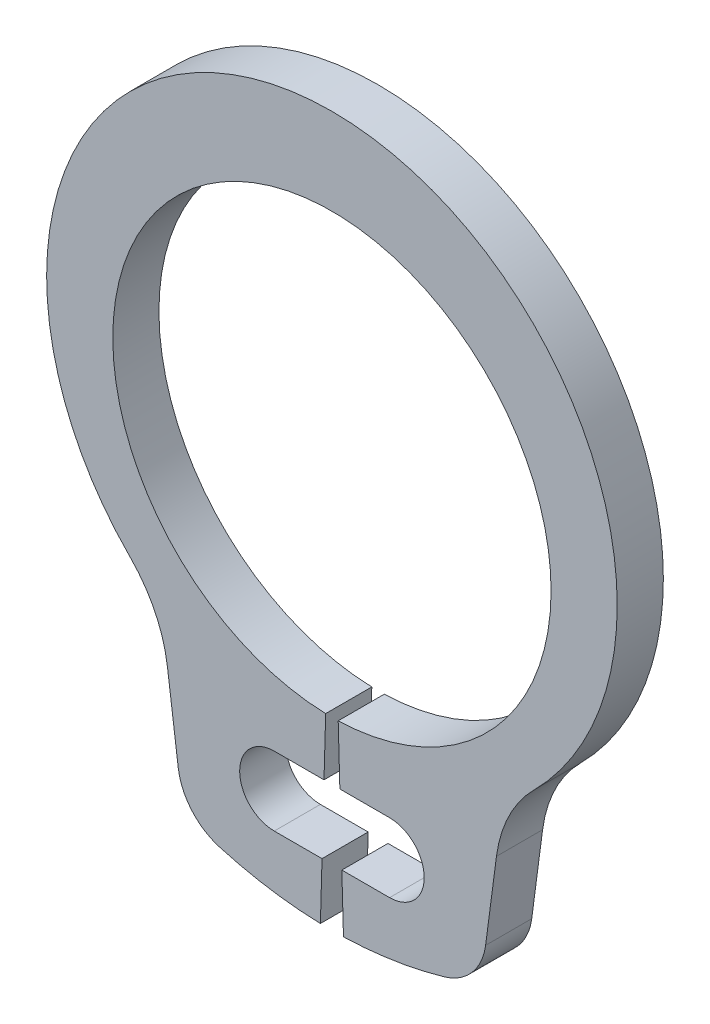
ISO-10303-21;
HEADER;
FILE_DESCRIPTION(('STEP AP214'),'2;1');
FILE_NAME('part.step','',(''),(''),'','','');
FILE_SCHEMA(('AUTOMOTIVE_DESIGN { 1 0 10303 214 1 1 1 1 }'));
ENDSEC;
DATA;
#1=APPLICATION_CONTEXT('core data for automotive mechanical design processes');
#2=APPLICATION_PROTOCOL_DEFINITION('international standard','automotive_design',2000,#1);
#3=PRODUCT_CONTEXT('',#1,'mechanical');
#4=PRODUCT('Part','Part','',(#3));
#5=PRODUCT_RELATED_PRODUCT_CATEGORY('part','',(#4));
#6=PRODUCT_DEFINITION_FORMATION('','',#4);
#7=PRODUCT_DEFINITION_CONTEXT('part definition',#1,'design');
#8=PRODUCT_DEFINITION('design','',#6,#7);
#9=PRODUCT_DEFINITION_SHAPE('','',#8);
#10=(LENGTH_UNIT() NAMED_UNIT(*) SI_UNIT(.MILLI.,.METRE.));
#11=(NAMED_UNIT(*) PLANE_ANGLE_UNIT() SI_UNIT($,.RADIAN.));
#12=(NAMED_UNIT(*) SI_UNIT($,.STERADIAN.) SOLID_ANGLE_UNIT());
#13=UNCERTAINTY_MEASURE_WITH_UNIT(LENGTH_MEASURE(1.E-05),#10,'distance_accuracy_value','');
#14=(GEOMETRIC_REPRESENTATION_CONTEXT(3) GLOBAL_UNCERTAINTY_ASSIGNED_CONTEXT((#13)) GLOBAL_UNIT_ASSIGNED_CONTEXT((#10,
#11,#12)) REPRESENTATION_CONTEXT('',''));
#15=CARTESIAN_POINT('',(0.,0.,0.));
#16=DIRECTION('',(0.,0.,1.));
#17=DIRECTION('',(1.,0.,0.));
#18=AXIS2_PLACEMENT_3D('',#15,#16,#17);
#19=CARTESIAN_POINT('',(-0.108571428571429,-3.7984486629278,-0.8));
#20=DIRECTION('',(0.999591753402051,-0.0285714285714286,0.));
#21=DIRECTION('',(0.0285714285714286,0.999591753402052,0.));
#22=AXIS2_PLACEMENT_3D('',#19,#20,#21);
#23=PLANE('',#22);
#24=DIRECTION('',(0.,0.,1.));
#25=VECTOR('',#24,1.);
#26=CARTESIAN_POINT('',(-0.13743687708596,-4.80832691319598,-0.8));
#27=LINE('',#26,#25);
#28=CARTESIAN_POINT('',(-0.13743687708596,-4.80832691319598,-0.8));
#29=VERTEX_POINT('',#28);
#30=CARTESIAN_POINT('',(-0.13743687708596,-4.80832691319598,0.));
#31=VERTEX_POINT('',#30);
#32=EDGE_CURVE('E203',#29,#31,#27,.T.);
#33=ORIENTED_EDGE('',*,*,#32,.F.);
#34=DIRECTION('',(0.0285714285714286,0.999591753402051,0.));
#35=VECTOR('',#34,1.);
#36=CARTESIAN_POINT('',(-0.108571428571429,-3.7984486629278,-0.8));
#37=LINE('',#36,#35);
#38=CARTESIAN_POINT('',(-0.108571428571429,-3.7984486629278,-0.8));
#39=VERTEX_POINT('',#38);
#40=EDGE_CURVE('E192',#29,#39,#37,.T.);
#41=ORIENTED_EDGE('',*,*,#40,.T.);
#42=DIRECTION('',(0.,0.,1.));
#43=VECTOR('',#42,1.);
#44=CARTESIAN_POINT('',(-0.108571428571429,-3.7984486629278,-0.8));
#45=LINE('',#44,#43);
#46=CARTESIAN_POINT('',(-0.108571428571429,-3.7984486629278,0.));
#47=VERTEX_POINT('',#46);
#48=EDGE_CURVE('E11',#39,#47,#45,.T.);
#49=ORIENTED_EDGE('',*,*,#48,.T.);
#50=DIRECTION('',(0.0285714285714286,0.999591753402051,0.));
#51=VECTOR('',#50,1.);
#52=CARTESIAN_POINT('',(-0.108571428571429,-3.7984486629278,0.));
#53=LINE('',#52,#51);
#54=EDGE_CURVE('E281',#31,#47,#53,.T.);
#55=ORIENTED_EDGE('',*,*,#54,.F.);
#56=EDGE_LOOP('',(#33,#41,#49,#55));
#57=FACE_BOUND('',#56,.T.);
#58=ADVANCED_FACE('F32',(#57),#23,.T.);
#59=CARTESIAN_POINT('',(0.108571428571429,-3.7984486629278,-0.8));
#60=DIRECTION('',(-0.999591753402051,-0.0285714285714286,0.));
#61=DIRECTION('',(0.0285714285714286,-0.999591753402052,0.));
#62=AXIS2_PLACEMENT_3D('',#59,#60,#61);
#63=PLANE('',#62);
#64=DIRECTION('',(0.,0.,-1.));
#65=VECTOR('',#64,1.);
#66=CARTESIAN_POINT('',(0.13743687708596,-4.80832691319598,-0.8));
#67=LINE('',#66,#65);
#68=CARTESIAN_POINT('',(0.13743687708596,-4.80832691319598,0.));
#69=VERTEX_POINT('',#68);
#70=CARTESIAN_POINT('',(0.13743687708596,-4.80832691319598,-0.8));
#71=VERTEX_POINT('',#70);
#72=EDGE_CURVE('E314',#69,#71,#67,.T.);
#73=ORIENTED_EDGE('',*,*,#72,.F.);
#74=DIRECTION('',(0.0285714285714286,-0.999591753402051,0.));
#75=VECTOR('',#74,1.);
#76=CARTESIAN_POINT('',(0.108571428571429,-3.7984486629278,0.));
#77=LINE('',#76,#75);
#78=CARTESIAN_POINT('',(0.108571428571429,-3.7984486629278,0.));
#79=VERTEX_POINT('',#78);
#80=EDGE_CURVE('E251',#79,#69,#77,.T.);
#81=ORIENTED_EDGE('',*,*,#80,.F.);
#82=DIRECTION('',(0.,0.,1.));
#83=VECTOR('',#82,1.);
#84=CARTESIAN_POINT('',(0.108571428571429,-3.7984486629278,-0.8));
#85=LINE('',#84,#83);
#86=CARTESIAN_POINT('',(0.108571428571429,-3.7984486629278,-0.8));
#87=VERTEX_POINT('',#86);
#88=EDGE_CURVE('E36',#87,#79,#85,.T.);
#89=ORIENTED_EDGE('',*,*,#88,.F.);
#90=DIRECTION('',(0.0285714285714286,-0.999591753402051,0.));
#91=VECTOR('',#90,1.);
#92=CARTESIAN_POINT('',(0.108571428571429,-3.7984486629278,-0.8));
#93=LINE('',#92,#91);
#94=EDGE_CURVE('E215',#87,#71,#93,.T.);
#95=ORIENTED_EDGE('',*,*,#94,.T.);
#96=EDGE_LOOP('',(#73,#81,#89,#95));
#97=FACE_BOUND('',#96,.T.);
#98=ADVANCED_FACE('F313',(#97),#63,.T.);
#99=CARTESIAN_POINT('',(0.,0.,-0.8));
#100=DIRECTION('',(0.,0.,1.));
#101=DIRECTION('',(1.,0.,0.));
#102=AXIS2_PLACEMENT_3D('',#99,#100,#101);
#103=CYLINDRICAL_SURFACE('',#102,3.8);
#104=CARTESIAN_POINT('',(0.,0.,0.));
#105=DIRECTION('',(0.,0.,-1.));
#106=DIRECTION('',(1.,0.,0.));
#107=AXIS2_PLACEMENT_3D('',#104,#105,#106);
#108=CIRCLE('',#107,3.8);
#109=EDGE_CURVE('E208',#47,#79,#108,.T.);
#110=ORIENTED_EDGE('',*,*,#109,.F.);
#111=ORIENTED_EDGE('',*,*,#48,.F.);
#112=CARTESIAN_POINT('',(0.,0.,-0.8));
#113=DIRECTION('',(0.,0.,-1.));
#114=DIRECTION('',(1.,0.,0.));
#115=AXIS2_PLACEMENT_3D('',#112,#113,#114);
#116=CIRCLE('',#115,3.8);
#117=EDGE_CURVE('E210',#39,#87,#116,.T.);
#118=ORIENTED_EDGE('',*,*,#117,.T.);
#119=ORIENTED_EDGE('',*,*,#88,.T.);
#120=EDGE_LOOP('',(#110,#111,#118,#119));
#121=FACE_BOUND('',#120,.T.);
#122=ADVANCED_FACE('F34',(#121),#103,.F.);
#123=DIRECTION('',(0.,0.,-1.));
#124=VECTOR('',#123,1.);
#125=CARTESIAN_POINT('',(-0.171736594114461,-6.00832691319598,-0.8));
#126=LINE('',#125,#124);
#127=CARTESIAN_POINT('',(-0.171736594114461,-6.00832691319598,0.));
#128=VERTEX_POINT('',#127);
#129=CARTESIAN_POINT('',(-0.171736594114461,-6.00832691319598,-0.8));
#130=VERTEX_POINT('',#129);
#131=EDGE_CURVE('E335',#128,#130,#126,.T.);
#132=ORIENTED_EDGE('',*,*,#131,.F.);
#133=CARTESIAN_POINT('',(-0.2,-6.99714227381436,0.));
#134=VERTEX_POINT('',#133);
#135=EDGE_CURVE('E214',#134,#128,#53,.T.);
#136=ORIENTED_EDGE('',*,*,#135,.F.);
#137=DIRECTION('',(0.,0.,1.));
#138=VECTOR('',#137,1.);
#139=CARTESIAN_POINT('',(-0.2,-6.99714227381436,-0.8));
#140=LINE('',#139,#138);
#141=CARTESIAN_POINT('',(-0.2,-6.99714227381436,-0.8));
#142=VERTEX_POINT('',#141);
#143=EDGE_CURVE('E41',#142,#134,#140,.T.);
#144=ORIENTED_EDGE('',*,*,#143,.F.);
#145=EDGE_CURVE('E245',#142,#130,#37,.T.);
#146=ORIENTED_EDGE('',*,*,#145,.T.);
#147=EDGE_LOOP('',(#132,#136,#144,#146));
#148=FACE_BOUND('',#147,.T.);
#149=ADVANCED_FACE('F383',(#148),#23,.T.);
#150=CARTESIAN_POINT('',(0.,0.,-0.8));
#151=DIRECTION('',(0.,0.,1.));
#152=DIRECTION('',(1.,0.,0.));
#153=AXIS2_PLACEMENT_3D('',#150,#151,#152);
#154=CYLINDRICAL_SURFACE('',#153,7.);
#155=CARTESIAN_POINT('',(0.,0.,0.));
#156=DIRECTION('',(0.,0.,1.));
#157=DIRECTION('',(1.,0.,0.));
#158=AXIS2_PLACEMENT_3D('',#155,#156,#157);
#159=CIRCLE('',#158,7.);
#160=CARTESIAN_POINT('',(-1.95199270347282,-6.72233028685655,0.));
#161=VERTEX_POINT('',#160);
#162=EDGE_CURVE('E278',#161,#134,#159,.T.);
#163=ORIENTED_EDGE('',*,*,#162,.F.);
#164=DIRECTION('',(0.,0.,1.));
#165=VECTOR('',#164,1.);
#166=CARTESIAN_POINT('',(-1.95199270347282,-6.72233028685655,-0.8));
#167=LINE('',#166,#165);
#168=CARTESIAN_POINT('',(-1.95199270347282,-6.72233028685655,-0.8));
#169=VERTEX_POINT('',#168);
#170=EDGE_CURVE('E285',#169,#161,#167,.T.);
#171=ORIENTED_EDGE('',*,*,#170,.F.);
#172=CARTESIAN_POINT('',(0.,0.,-0.8));
#173=DIRECTION('',(0.,0.,1.));
#174=DIRECTION('',(1.,0.,0.));
#175=AXIS2_PLACEMENT_3D('',#172,#173,#174);
#176=CIRCLE('',#175,7.);
#177=EDGE_CURVE('E242',#169,#142,#176,.T.);
#178=ORIENTED_EDGE('',*,*,#177,.T.);
#179=ORIENTED_EDGE('',*,*,#143,.T.);
#180=EDGE_LOOP('',(#163,#171,#178,#179));
#181=FACE_BOUND('',#180,.T.);
#182=ADVANCED_FACE('F379',(#181),#154,.T.);
#183=CARTESIAN_POINT('',(-1.6731366029767,-5.76199738873419,-0.8));
#184=DIRECTION('',(0.,0.,1.));
#185=DIRECTION('',(1.,0.,0.));
#186=AXIS2_PLACEMENT_3D('',#183,#184,#185);
#187=CYLINDRICAL_SURFACE('',#186,1.);
#188=CARTESIAN_POINT('',(-1.6731366029767,-5.76199738873419,0.));
#189=DIRECTION('',(0.,0.,1.));
#190=DIRECTION('',(1.,0.,0.));
#191=AXIS2_PLACEMENT_3D('',#188,#189,#190);
#192=CIRCLE('',#191,1.);
#193=CARTESIAN_POINT('',(-2.66458146435051,-5.89252358095424,0.));
#194=VERTEX_POINT('',#193);
#195=EDGE_CURVE('E275',#194,#161,#192,.T.);
#196=ORIENTED_EDGE('',*,*,#195,.F.);
#197=DIRECTION('',(0.,0.,1.));
#198=VECTOR('',#197,1.);
#199=CARTESIAN_POINT('',(-2.66458146435051,-5.89252358095424,-0.8));
#200=LINE('',#199,#198);
#201=CARTESIAN_POINT('',(-2.66458146435051,-5.89252358095424,-0.8));
#202=VERTEX_POINT('',#201);
#203=EDGE_CURVE('E287',#202,#194,#200,.T.);
#204=ORIENTED_EDGE('',*,*,#203,.F.);
#205=CARTESIAN_POINT('',(-1.6731366029767,-5.76199738873419,-0.8));
#206=DIRECTION('',(0.,0.,1.));
#207=DIRECTION('',(1.,0.,0.));
#208=AXIS2_PLACEMENT_3D('',#205,#206,#207);
#209=CIRCLE('',#208,1.);
#210=EDGE_CURVE('E239',#202,#169,#209,.T.);
#211=ORIENTED_EDGE('',*,*,#210,.T.);
#212=ORIENTED_EDGE('',*,*,#170,.T.);
#213=EDGE_LOOP('',(#196,#204,#211,#212));
#214=FACE_BOUND('',#213,.T.);
#215=ADVANCED_FACE('F375',(#214),#187,.T.);
#216=CARTESIAN_POINT('',(-2.85298125232632,-4.46148511660048,-0.8));
#217=DIRECTION('',(-0.99144486137381,-0.130526192220051,0.));
#218=DIRECTION('',(0.130526192220051,-0.991444861373811,0.));
#219=AXIS2_PLACEMENT_3D('',#216,#217,#218);
#220=PLANE('',#219);
#221=DIRECTION('',(0.130526192220051,-0.99144486137381,0.));
#222=VECTOR('',#221,1.);
#223=CARTESIAN_POINT('',(-2.85298125232632,-4.46148511660048,0.));
#224=LINE('',#223,#222);
#225=CARTESIAN_POINT('',(-2.85298125232632,-4.46148511660048,0.));
#226=VERTEX_POINT('',#225);
#227=EDGE_CURVE('E272',#226,#194,#224,.T.);
#228=ORIENTED_EDGE('',*,*,#227,.F.);
#229=DIRECTION('',(0.,0.,1.));
#230=VECTOR('',#229,1.);
#231=CARTESIAN_POINT('',(-2.85298125232632,-4.46148511660048,-0.8));
#232=LINE('',#231,#230);
#233=CARTESIAN_POINT('',(-2.85298125232632,-4.46148511660048,-0.8));
#234=VERTEX_POINT('',#233);
#235=EDGE_CURVE('E289',#234,#226,#232,.T.);
#236=ORIENTED_EDGE('',*,*,#235,.F.);
#237=DIRECTION('',(0.130526192220051,-0.99144486137381,0.));
#238=VECTOR('',#237,1.);
#239=CARTESIAN_POINT('',(-2.85298125232632,-4.46148511660048,-0.8));
#240=LINE('',#239,#238);
#241=EDGE_CURVE('E236',#234,#202,#240,.T.);
#242=ORIENTED_EDGE('',*,*,#241,.T.);
#243=ORIENTED_EDGE('',*,*,#203,.T.);
#244=EDGE_LOOP('',(#228,#236,#242,#243));
#245=FACE_BOUND('',#244,.T.);
#246=ADVANCED_FACE('F370',(#245),#220,.T.);
#247=CARTESIAN_POINT('',(-5.13117241134197,-4.76141467266642,-0.8));
#248=DIRECTION('',(0.,0.,1.));
#249=DIRECTION('',(1.,0.,0.));
#250=AXIS2_PLACEMENT_3D('',#247,#248,#249);
#251=CYLINDRICAL_SURFACE('',#250,2.29784958072085);
#252=CARTESIAN_POINT('',(-5.13117241134197,-4.76141467266642,0.));
#253=DIRECTION('',(0.,0.,-1.));
#254=DIRECTION('',(1.,0.,0.));
#255=AXIS2_PLACEMENT_3D('',#252,#253,#254);
#256=CIRCLE('',#255,2.29784958072085);
#257=CARTESIAN_POINT('',(-3.5037027583481,-3.13923859584769,0.));
#258=VERTEX_POINT('',#257);
#259=EDGE_CURVE('E269',#258,#226,#256,.T.);
#260=ORIENTED_EDGE('',*,*,#259,.F.);
#261=DIRECTION('',(0.,0.,1.));
#262=VECTOR('',#261,1.);
#263=CARTESIAN_POINT('',(-3.5037027583481,-3.13923859584769,-0.8));
#264=LINE('',#263,#262);
#265=CARTESIAN_POINT('',(-3.5037027583481,-3.13923859584769,-0.8));
#266=VERTEX_POINT('',#265);
#267=EDGE_CURVE('E291',#266,#258,#264,.T.);
#268=ORIENTED_EDGE('',*,*,#267,.F.);
#269=CARTESIAN_POINT('',(-5.13117241134197,-4.76141467266642,-0.8));
#270=DIRECTION('',(0.,0.,-1.));
#271=DIRECTION('',(1.,0.,0.));
#272=AXIS2_PLACEMENT_3D('',#269,#270,#271);
#273=CIRCLE('',#272,2.29784958072085);
#274=EDGE_CURVE('E233',#266,#234,#273,.T.);
#275=ORIENTED_EDGE('',*,*,#274,.T.);
#276=ORIENTED_EDGE('',*,*,#235,.T.);
#277=EDGE_LOOP('',(#260,#268,#275,#276));
#278=FACE_BOUND('',#277,.T.);
#279=ADVANCED_FACE('F366',(#278),#251,.F.);
#280=CARTESIAN_POINT('',(0.,0.35306787169261,-0.8));
#281=DIRECTION('',(0.,0.,1.));
#282=DIRECTION('',(1.,0.,0.));
#283=AXIS2_PLACEMENT_3D('',#280,#281,#282);
#284=CYLINDRICAL_SURFACE('',#283,4.94693212830739);
#285=CARTESIAN_POINT('',(0.,0.35306787169261,0.));
#286=DIRECTION('',(0.,0.,1.));
#287=DIRECTION('',(1.,0.,0.));
#288=AXIS2_PLACEMENT_3D('',#285,#286,#287);
#289=CIRCLE('',#288,4.94693212830739);
#290=CARTESIAN_POINT('',(3.5037027583481,-3.13923859584769,0.));
#291=VERTEX_POINT('',#290);
#292=EDGE_CURVE('E266',#291,#258,#289,.T.);
#293=ORIENTED_EDGE('',*,*,#292,.F.);
#294=DIRECTION('',(0.,0.,1.));
#295=VECTOR('',#294,1.);
#296=CARTESIAN_POINT('',(3.5037027583481,-3.13923859584769,-0.8));
#297=LINE('',#296,#295);
#298=CARTESIAN_POINT('',(3.5037027583481,-3.13923859584769,-0.8));
#299=VERTEX_POINT('',#298);
#300=EDGE_CURVE('E293',#299,#291,#297,.T.);
#301=ORIENTED_EDGE('',*,*,#300,.F.);
#302=CARTESIAN_POINT('',(0.,0.35306787169261,-0.8));
#303=DIRECTION('',(0.,0.,1.));
#304=DIRECTION('',(1.,0.,0.));
#305=AXIS2_PLACEMENT_3D('',#302,#303,#304);
#306=CIRCLE('',#305,4.94693212830739);
#307=EDGE_CURVE('E230',#299,#266,#306,.T.);
#308=ORIENTED_EDGE('',*,*,#307,.T.);
#309=ORIENTED_EDGE('',*,*,#267,.T.);
#310=EDGE_LOOP('',(#293,#301,#308,#309));
#311=FACE_BOUND('',#310,.T.);
#312=ADVANCED_FACE('F362',(#311),#284,.T.);
#313=CARTESIAN_POINT('',(5.13117241134197,-4.76141467266642,-0.8));
#314=DIRECTION('',(0.,0.,1.));
#315=DIRECTION('',(1.,0.,0.));
#316=AXIS2_PLACEMENT_3D('',#313,#314,#315);
#317=CYLINDRICAL_SURFACE('',#316,2.29784958072085);
#318=CARTESIAN_POINT('',(5.13117241134197,-4.76141467266642,0.));
#319=DIRECTION('',(0.,0.,-1.));
#320=DIRECTION('',(1.,0.,0.));
#321=AXIS2_PLACEMENT_3D('',#318,#319,#320);
#322=CIRCLE('',#321,2.29784958072085);
#323=CARTESIAN_POINT('',(2.85298125232632,-4.46148511660048,0.));
#324=VERTEX_POINT('',#323);
#325=EDGE_CURVE('E263',#324,#291,#322,.T.);
#326=ORIENTED_EDGE('',*,*,#325,.F.);
#327=DIRECTION('',(0.,0.,1.));
#328=VECTOR('',#327,1.);
#329=CARTESIAN_POINT('',(2.85298125232632,-4.46148511660048,-0.8));
#330=LINE('',#329,#328);
#331=CARTESIAN_POINT('',(2.85298125232632,-4.46148511660048,-0.8));
#332=VERTEX_POINT('',#331);
#333=EDGE_CURVE('E295',#332,#324,#330,.T.);
#334=ORIENTED_EDGE('',*,*,#333,.F.);
#335=CARTESIAN_POINT('',(5.13117241134197,-4.76141467266642,-0.8));
#336=DIRECTION('',(0.,0.,-1.));
#337=DIRECTION('',(1.,0.,0.));
#338=AXIS2_PLACEMENT_3D('',#335,#336,#337);
#339=CIRCLE('',#338,2.29784958072085);
#340=EDGE_CURVE('E227',#332,#299,#339,.T.);
#341=ORIENTED_EDGE('',*,*,#340,.T.);
#342=ORIENTED_EDGE('',*,*,#300,.T.);
#343=EDGE_LOOP('',(#326,#334,#341,#342));
#344=FACE_BOUND('',#343,.T.);
#345=ADVANCED_FACE('F358',(#344),#317,.F.);
#346=CARTESIAN_POINT('',(2.85298125232632,-4.46148511660048,-0.8));
#347=DIRECTION('',(0.99144486137381,-0.130526192220051,0.));
#348=DIRECTION('',(0.130526192220051,0.991444861373811,0.));
#349=AXIS2_PLACEMENT_3D('',#346,#347,#348);
#350=PLANE('',#349);
#351=DIRECTION('',(0.130526192220051,0.99144486137381,0.));
#352=VECTOR('',#351,1.);
#353=CARTESIAN_POINT('',(2.85298125232632,-4.46148511660048,0.));
#354=LINE('',#353,#352);
#355=CARTESIAN_POINT('',(2.66458146435051,-5.89252358095424,0.));
#356=VERTEX_POINT('',#355);
#357=EDGE_CURVE('E260',#356,#324,#354,.T.);
#358=ORIENTED_EDGE('',*,*,#357,.F.);
#359=DIRECTION('',(0.,0.,1.));
#360=VECTOR('',#359,1.);
#361=CARTESIAN_POINT('',(2.66458146435051,-5.89252358095424,-0.8));
#362=LINE('',#361,#360);
#363=CARTESIAN_POINT('',(2.66458146435051,-5.89252358095424,-0.8));
#364=VERTEX_POINT('',#363);
#365=EDGE_CURVE('E297',#364,#356,#362,.T.);
#366=ORIENTED_EDGE('',*,*,#365,.F.);
#367=DIRECTION('',(0.130526192220051,0.99144486137381,0.));
#368=VECTOR('',#367,1.);
#369=CARTESIAN_POINT('',(2.85298125232632,-4.46148511660048,-0.8));
#370=LINE('',#369,#368);
#371=EDGE_CURVE('E224',#364,#332,#370,.T.);
#372=ORIENTED_EDGE('',*,*,#371,.T.);
#373=ORIENTED_EDGE('',*,*,#333,.T.);
#374=EDGE_LOOP('',(#358,#366,#372,#373));
#375=FACE_BOUND('',#374,.T.);
#376=ADVANCED_FACE('F354',(#375),#350,.T.);
#377=CARTESIAN_POINT('',(1.6731366029767,-5.76199738873419,-0.8));
#378=DIRECTION('',(0.,0.,1.));
#379=DIRECTION('',(1.,0.,0.));
#380=AXIS2_PLACEMENT_3D('',#377,#378,#379);
#381=CYLINDRICAL_SURFACE('',#380,1.);
#382=CARTESIAN_POINT('',(1.6731366029767,-5.76199738873419,0.));
#383=DIRECTION('',(0.,0.,1.));
#384=DIRECTION('',(-1.,0.,0.));
#385=AXIS2_PLACEMENT_3D('',#382,#383,#384);
#386=CIRCLE('',#385,1.);
#387=CARTESIAN_POINT('',(1.95199270347282,-6.72233028685655,0.));
#388=VERTEX_POINT('',#387);
#389=EDGE_CURVE('E257',#388,#356,#386,.T.);
#390=ORIENTED_EDGE('',*,*,#389,.F.);
#391=DIRECTION('',(0.,0.,1.));
#392=VECTOR('',#391,1.);
#393=CARTESIAN_POINT('',(1.95199270347282,-6.72233028685655,-0.8));
#394=LINE('',#393,#392);
#395=CARTESIAN_POINT('',(1.95199270347282,-6.72233028685655,-0.8));
#396=VERTEX_POINT('',#395);
#397=EDGE_CURVE('E299',#396,#388,#394,.T.);
#398=ORIENTED_EDGE('',*,*,#397,.F.);
#399=CARTESIAN_POINT('',(1.6731366029767,-5.76199738873419,-0.8));
#400=DIRECTION('',(0.,0.,1.));
#401=DIRECTION('',(-1.,0.,0.));
#402=AXIS2_PLACEMENT_3D('',#399,#400,#401);
#403=CIRCLE('',#402,1.);
#404=EDGE_CURVE('E221',#396,#364,#403,.T.);
#405=ORIENTED_EDGE('',*,*,#404,.T.);
#406=ORIENTED_EDGE('',*,*,#365,.T.);
#407=EDGE_LOOP('',(#390,#398,#405,#406));
#408=FACE_BOUND('',#407,.T.);
#409=ADVANCED_FACE('F351',(#408),#381,.T.);
#410=CARTESIAN_POINT('',(0.,0.,-0.8));
#411=DIRECTION('',(0.,0.,1.));
#412=DIRECTION('',(1.,0.,0.));
#413=AXIS2_PLACEMENT_3D('',#410,#411,#412);
#414=CYLINDRICAL_SURFACE('',#413,7.);
#415=CARTESIAN_POINT('',(0.,0.,0.));
#416=DIRECTION('',(0.,0.,1.));
#417=DIRECTION('',(1.,0.,0.));
#418=AXIS2_PLACEMENT_3D('',#415,#416,#417);
#419=CIRCLE('',#418,7.);
#420=CARTESIAN_POINT('',(0.199999999999999,-6.99714227381436,0.));
#421=VERTEX_POINT('',#420);
#422=EDGE_CURVE('E254',#421,#388,#419,.T.);
#423=ORIENTED_EDGE('',*,*,#422,.F.);
#424=DIRECTION('',(0.,0.,1.));
#425=VECTOR('',#424,1.);
#426=CARTESIAN_POINT('',(0.199999999999999,-6.99714227381436,-0.8));
#427=LINE('',#426,#425);
#428=CARTESIAN_POINT('',(0.199999999999999,-6.99714227381436,-0.8));
#429=VERTEX_POINT('',#428);
#430=EDGE_CURVE('E300',#429,#421,#427,.T.);
#431=ORIENTED_EDGE('',*,*,#430,.F.);
#432=CARTESIAN_POINT('',(0.,0.,-0.8));
#433=DIRECTION('',(0.,0.,1.));
#434=DIRECTION('',(1.,0.,0.));
#435=AXIS2_PLACEMENT_3D('',#432,#433,#434);
#436=CIRCLE('',#435,7.);
#437=EDGE_CURVE('E218',#429,#396,#436,.T.);
#438=ORIENTED_EDGE('',*,*,#437,.T.);
#439=ORIENTED_EDGE('',*,*,#397,.T.);
#440=EDGE_LOOP('',(#423,#431,#438,#439));
#441=FACE_BOUND('',#440,.T.);
#442=ADVANCED_FACE('F347',(#441),#414,.T.);
#443=DIRECTION('',(0.,0.,1.));
#444=VECTOR('',#443,1.);
#445=CARTESIAN_POINT('',(0.171736594114461,-6.00832691319598,-0.8));
#446=LINE('',#445,#444);
#447=CARTESIAN_POINT('',(0.171736594114461,-6.00832691319598,-0.8));
#448=VERTEX_POINT('',#447);
#449=CARTESIAN_POINT('',(0.171736594114461,-6.00832691319598,0.));
#450=VERTEX_POINT('',#449);
#451=EDGE_CURVE('E330',#448,#450,#446,.T.);
#452=ORIENTED_EDGE('',*,*,#451,.F.);
#453=EDGE_CURVE('E213',#448,#429,#93,.T.);
#454=ORIENTED_EDGE('',*,*,#453,.T.);
#455=ORIENTED_EDGE('',*,*,#430,.T.);
#456=EDGE_CURVE('E250',#450,#421,#77,.T.);
#457=ORIENTED_EDGE('',*,*,#456,.F.);
#458=EDGE_LOOP('',(#452,#454,#455,#457));
#459=FACE_BOUND('',#458,.T.);
#460=ADVANCED_FACE('F345',(#459),#63,.T.);
#461=CARTESIAN_POINT('',(0.,0.,-0.8));
#462=DIRECTION('',(0.,0.,1.));
#463=DIRECTION('',(1.,0.,0.));
#464=AXIS2_PLACEMENT_3D('',#461,#462,#463);
#465=PLANE('',#464);
#466=CARTESIAN_POINT('',(1.,-5.40832691319598,-0.8));
#467=DIRECTION('',(0.,0.,1.));
#468=DIRECTION('',(1.,0.,0.));
#469=AXIS2_PLACEMENT_3D('',#466,#467,#468);
#470=CIRCLE('',#469,0.6);
#471=CARTESIAN_POINT('',(1.,-6.00832691319598,-0.8));
#472=VERTEX_POINT('',#471);
#473=CARTESIAN_POINT('',(1.,-4.80832691319598,-0.8));
#474=VERTEX_POINT('',#473);
#475=EDGE_CURVE('E201',#472,#474,#470,.T.);
#476=ORIENTED_EDGE('',*,*,#475,.T.);
#477=DIRECTION('',(-1.,0.,0.));
#478=VECTOR('',#477,1.);
#479=CARTESIAN_POINT('',(-1.,-4.80832691319598,-0.8));
#480=LINE('',#479,#478);
#481=EDGE_CURVE('E57',#474,#71,#480,.T.);
#482=ORIENTED_EDGE('',*,*,#481,.T.);
#483=ORIENTED_EDGE('',*,*,#94,.F.);
#484=ORIENTED_EDGE('',*,*,#117,.F.);
#485=ORIENTED_EDGE('',*,*,#40,.F.);
#486=CARTESIAN_POINT('',(-1.,-4.80832691319598,-0.8));
#487=VERTEX_POINT('',#486);
#488=EDGE_CURVE('E173',#29,#487,#480,.T.);
#489=ORIENTED_EDGE('',*,*,#488,.T.);
#490=CARTESIAN_POINT('',(-1.,-5.40832691319598,-0.8));
#491=DIRECTION('',(0.,0.,1.));
#492=DIRECTION('',(1.,0.,0.));
#493=AXIS2_PLACEMENT_3D('',#490,#491,#492);
#494=CIRCLE('',#493,0.6);
#495=CARTESIAN_POINT('',(-1.,-6.00832691319598,-0.8));
#496=VERTEX_POINT('',#495);
#497=EDGE_CURVE('E190',#487,#496,#494,.T.);
#498=ORIENTED_EDGE('',*,*,#497,.T.);
#499=DIRECTION('',(1.,0.,0.));
#500=VECTOR('',#499,1.);
#501=CARTESIAN_POINT('',(1.,-6.00832691319598,-0.8));
#502=LINE('',#501,#500);
#503=EDGE_CURVE('E182',#496,#130,#502,.T.);
#504=ORIENTED_EDGE('',*,*,#503,.T.);
#505=ORIENTED_EDGE('',*,*,#145,.F.);
#506=ORIENTED_EDGE('',*,*,#177,.F.);
#507=ORIENTED_EDGE('',*,*,#210,.F.);
#508=ORIENTED_EDGE('',*,*,#241,.F.);
#509=ORIENTED_EDGE('',*,*,#274,.F.);
#510=ORIENTED_EDGE('',*,*,#307,.F.);
#511=ORIENTED_EDGE('',*,*,#340,.F.);
#512=ORIENTED_EDGE('',*,*,#371,.F.);
#513=ORIENTED_EDGE('',*,*,#404,.F.);
#514=ORIENTED_EDGE('',*,*,#437,.F.);
#515=ORIENTED_EDGE('',*,*,#453,.F.);
#516=EDGE_CURVE('E322',#448,#472,#502,.T.);
#517=ORIENTED_EDGE('',*,*,#516,.T.);
#518=EDGE_LOOP('',(#476,#482,#483,#484,#485,#489,#498,#504,#505,#506,#507,#508,#509,#510,#511,
#512,#513,#514,#515,#517));
#519=FACE_BOUND('',#518,.T.);
#520=ADVANCED_FACE('F188',(#519),#465,.F.);
#521=CARTESIAN_POINT('',(0.,0.,0.));
#522=DIRECTION('',(0.,0.,1.));
#523=DIRECTION('',(1.,0.,0.));
#524=AXIS2_PLACEMENT_3D('',#521,#522,#523);
#525=PLANE('',#524);
#526=DIRECTION('',(-1.,0.,0.));
#527=VECTOR('',#526,1.);
#528=CARTESIAN_POINT('',(-1.,-4.80832691319598,0.));
#529=LINE('',#528,#527);
#530=CARTESIAN_POINT('',(1.,-4.80832691319598,0.));
#531=VERTEX_POINT('',#530);
#532=EDGE_CURVE('E325',#531,#69,#529,.T.);
#533=ORIENTED_EDGE('',*,*,#532,.F.);
#534=CARTESIAN_POINT('',(1.,-5.40832691319598,0.));
#535=DIRECTION('',(0.,0.,1.));
#536=DIRECTION('',(1.,0.,0.));
#537=AXIS2_PLACEMENT_3D('',#534,#535,#536);
#538=CIRCLE('',#537,0.6);
#539=CARTESIAN_POINT('',(1.,-6.00832691319598,0.));
#540=VERTEX_POINT('',#539);
#541=EDGE_CURVE('E197',#540,#531,#538,.T.);
#542=ORIENTED_EDGE('',*,*,#541,.F.);
#543=DIRECTION('',(1.,0.,0.));
#544=VECTOR('',#543,1.);
#545=CARTESIAN_POINT('',(1.,-6.00832691319598,0.));
#546=LINE('',#545,#544);
#547=EDGE_CURVE('E49',#450,#540,#546,.T.);
#548=ORIENTED_EDGE('',*,*,#547,.F.);
#549=ORIENTED_EDGE('',*,*,#456,.T.);
#550=ORIENTED_EDGE('',*,*,#422,.T.);
#551=ORIENTED_EDGE('',*,*,#389,.T.);
#552=ORIENTED_EDGE('',*,*,#357,.T.);
#553=ORIENTED_EDGE('',*,*,#325,.T.);
#554=ORIENTED_EDGE('',*,*,#292,.T.);
#555=ORIENTED_EDGE('',*,*,#259,.T.);
#556=ORIENTED_EDGE('',*,*,#227,.T.);
#557=ORIENTED_EDGE('',*,*,#195,.T.);
#558=ORIENTED_EDGE('',*,*,#162,.T.);
#559=ORIENTED_EDGE('',*,*,#135,.T.);
#560=CARTESIAN_POINT('',(-1.,-6.00832691319598,0.));
#561=VERTEX_POINT('',#560);
#562=EDGE_CURVE('E193',#561,#128,#546,.T.);
#563=ORIENTED_EDGE('',*,*,#562,.F.);
#564=CARTESIAN_POINT('',(-1.,-5.40832691319598,0.));
#565=DIRECTION('',(0.,0.,1.));
#566=DIRECTION('',(1.,0.,0.));
#567=AXIS2_PLACEMENT_3D('',#564,#565,#566);
#568=CIRCLE('',#567,0.6);
#569=CARTESIAN_POINT('',(-1.,-4.80832691319598,0.));
#570=VERTEX_POINT('',#569);
#571=EDGE_CURVE('E198',#570,#561,#568,.T.);
#572=ORIENTED_EDGE('',*,*,#571,.F.);
#573=EDGE_CURVE('E176',#31,#570,#529,.T.);
#574=ORIENTED_EDGE('',*,*,#573,.F.);
#575=ORIENTED_EDGE('',*,*,#54,.T.);
#576=ORIENTED_EDGE('',*,*,#109,.T.);
#577=ORIENTED_EDGE('',*,*,#80,.T.);
#578=EDGE_LOOP('',(#533,#542,#548,#549,#550,#551,#552,#553,#554,#555,#556,#557,#558,#559,#563,
#572,#574,#575,#576,#577));
#579=FACE_BOUND('',#578,.T.);
#580=ADVANCED_FACE('F317',(#579),#525,.T.);
#581=CARTESIAN_POINT('',(1.,-5.40832691319598,-0.8));
#582=DIRECTION('',(0.,0.,1.));
#583=DIRECTION('',(1.,0.,0.));
#584=AXIS2_PLACEMENT_3D('',#581,#582,#583);
#585=CYLINDRICAL_SURFACE('',#584,0.6);
#586=ORIENTED_EDGE('',*,*,#541,.T.);
#587=DIRECTION('',(0.,0.,1.));
#588=VECTOR('',#587,1.);
#589=CARTESIAN_POINT('',(1.,-4.80832691319598,-0.8));
#590=LINE('',#589,#588);
#591=EDGE_CURVE('E328',#474,#531,#590,.T.);
#592=ORIENTED_EDGE('',*,*,#591,.F.);
#593=ORIENTED_EDGE('',*,*,#475,.F.);
#594=DIRECTION('',(0.,0.,1.));
#595=VECTOR('',#594,1.);
#596=CARTESIAN_POINT('',(1.,-6.00832691319598,-0.8));
#597=LINE('',#596,#595);
#598=EDGE_CURVE('E331',#472,#540,#597,.T.);
#599=ORIENTED_EDGE('',*,*,#598,.T.);
#600=EDGE_LOOP('',(#586,#592,#593,#599));
#601=FACE_BOUND('',#600,.T.);
#602=ADVANCED_FACE('F339',(#601),#585,.F.);
#603=CARTESIAN_POINT('',(-1.,-5.40832691319598,-0.8));
#604=DIRECTION('',(0.,0.,1.));
#605=DIRECTION('',(1.,0.,0.));
#606=AXIS2_PLACEMENT_3D('',#603,#604,#605);
#607=CYLINDRICAL_SURFACE('',#606,0.6);
#608=ORIENTED_EDGE('',*,*,#571,.T.);
#609=DIRECTION('',(0.,0.,1.));
#610=VECTOR('',#609,1.);
#611=CARTESIAN_POINT('',(-1.,-6.00832691319598,-0.8));
#612=LINE('',#611,#610);
#613=EDGE_CURVE('E181',#496,#561,#612,.T.);
#614=ORIENTED_EDGE('',*,*,#613,.F.);
#615=ORIENTED_EDGE('',*,*,#497,.F.);
#616=DIRECTION('',(0.,0.,1.));
#617=VECTOR('',#616,1.);
#618=CARTESIAN_POINT('',(-1.,-4.80832691319598,-0.8));
#619=LINE('',#618,#617);
#620=EDGE_CURVE('E170',#487,#570,#619,.T.);
#621=ORIENTED_EDGE('',*,*,#620,.T.);
#622=EDGE_LOOP('',(#608,#614,#615,#621));
#623=FACE_BOUND('',#622,.T.);
#624=ADVANCED_FACE('F196',(#623),#607,.F.);
#625=CARTESIAN_POINT('',(-1.,-4.80832691319598,-0.8));
#626=DIRECTION('',(0.,1.,0.));
#627=DIRECTION('',(0.,0.,1.));
#628=AXIS2_PLACEMENT_3D('',#625,#626,#627);
#629=PLANE('',#628);
#630=ORIENTED_EDGE('',*,*,#32,.T.);
#631=ORIENTED_EDGE('',*,*,#573,.T.);
#632=ORIENTED_EDGE('',*,*,#620,.F.);
#633=ORIENTED_EDGE('',*,*,#488,.F.);
#634=EDGE_LOOP('',(#630,#631,#632,#633));
#635=FACE_BOUND('',#634,.T.);
#636=ADVANCED_FACE('F172',(#635),#629,.F.);
#637=CARTESIAN_POINT('',(1.,-6.00832691319598,-0.8));
#638=DIRECTION('',(0.,-1.,0.));
#639=DIRECTION('',(0.,0.,-1.));
#640=AXIS2_PLACEMENT_3D('',#637,#638,#639);
#641=PLANE('',#640);
#642=ORIENTED_EDGE('',*,*,#131,.T.);
#643=ORIENTED_EDGE('',*,*,#503,.F.);
#644=ORIENTED_EDGE('',*,*,#613,.T.);
#645=ORIENTED_EDGE('',*,*,#562,.T.);
#646=EDGE_LOOP('',(#642,#643,#644,#645));
#647=FACE_BOUND('',#646,.T.);
#648=ADVANCED_FACE('F386',(#647),#641,.F.);
#649=ORIENTED_EDGE('',*,*,#451,.T.);
#650=ORIENTED_EDGE('',*,*,#547,.T.);
#651=ORIENTED_EDGE('',*,*,#598,.F.);
#652=ORIENTED_EDGE('',*,*,#516,.F.);
#653=EDGE_LOOP('',(#649,#650,#651,#652));
#654=FACE_BOUND('',#653,.T.);
#655=ADVANCED_FACE('F340',(#654),#641,.F.);
#656=ORIENTED_EDGE('',*,*,#72,.T.);
#657=ORIENTED_EDGE('',*,*,#481,.F.);
#658=ORIENTED_EDGE('',*,*,#591,.T.);
#659=ORIENTED_EDGE('',*,*,#532,.T.);
#660=EDGE_LOOP('',(#656,#657,#658,#659));
#661=FACE_BOUND('',#660,.T.);
#662=ADVANCED_FACE('F336',(#661),#629,.F.);
#663=CLOSED_SHELL('',(#58,#98,#122,#149,#182,#215,#246,#279,#312,#345,#376,#409,#442,#460,#520,
#580,#602,#624,#636,#648,#655,#662));
#664=MANIFOLD_SOLID_BREP('B2',#663);
#665=ADVANCED_BREP_SHAPE_REPRESENTATION('',(#18,#664),#14);
#666=SHAPE_DEFINITION_REPRESENTATION(#9,#665);
ENDSEC;
END-ISO-10303-21;
